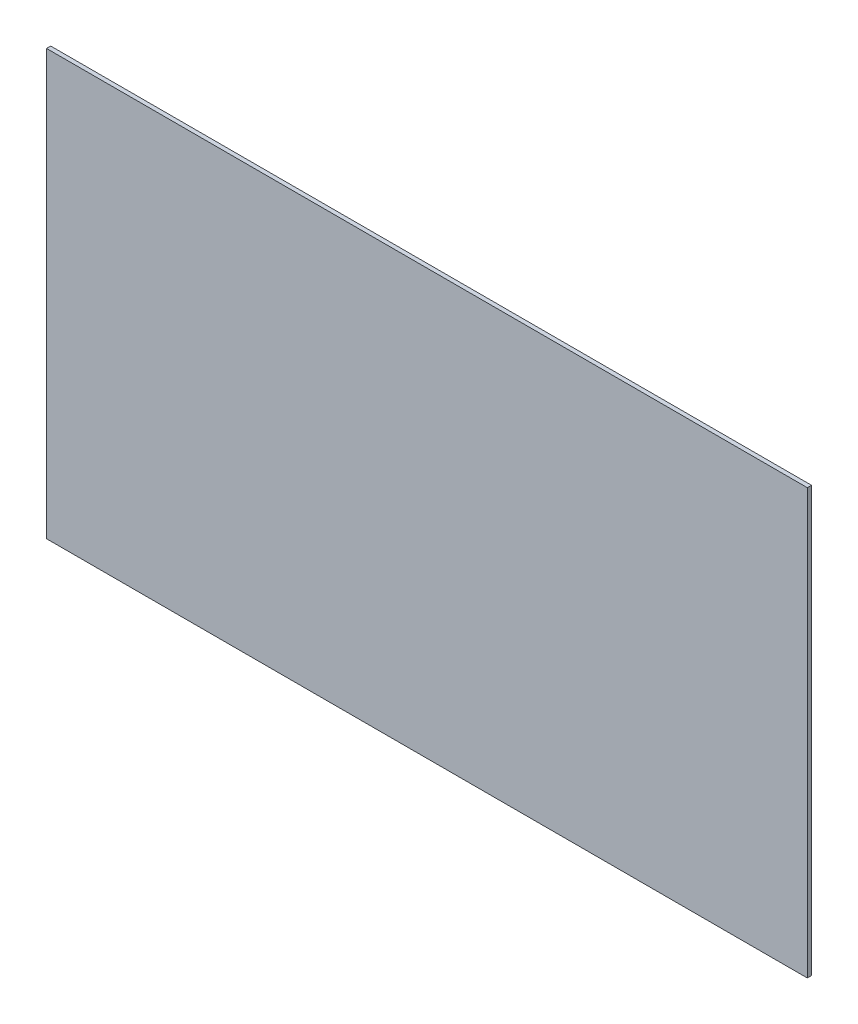
ISO-10303-21;
HEADER;
FILE_DESCRIPTION(('STEP AP214'),'2;1');
FILE_NAME('part.step','',(''),(''),'','','');
FILE_SCHEMA(('AUTOMOTIVE_DESIGN { 1 0 10303 214 1 1 1 1 }'));
ENDSEC;
DATA;
#1=APPLICATION_CONTEXT('core data for automotive mechanical design processes');
#2=APPLICATION_PROTOCOL_DEFINITION('international standard','automotive_design',2000,#1);
#3=PRODUCT_CONTEXT('',#1,'mechanical');
#4=PRODUCT('Part','Part','',(#3));
#5=PRODUCT_RELATED_PRODUCT_CATEGORY('part','',(#4));
#6=PRODUCT_DEFINITION_FORMATION('','',#4);
#7=PRODUCT_DEFINITION_CONTEXT('part definition',#1,'design');
#8=PRODUCT_DEFINITION('design','',#6,#7);
#9=PRODUCT_DEFINITION_SHAPE('','',#8);
#10=(LENGTH_UNIT() NAMED_UNIT(*) SI_UNIT(.MILLI.,.METRE.));
#11=(NAMED_UNIT(*) PLANE_ANGLE_UNIT() SI_UNIT($,.RADIAN.));
#12=(NAMED_UNIT(*) SI_UNIT($,.STERADIAN.) SOLID_ANGLE_UNIT());
#13=UNCERTAINTY_MEASURE_WITH_UNIT(LENGTH_MEASURE(1.E-05),#10,'distance_accuracy_value','');
#14=(GEOMETRIC_REPRESENTATION_CONTEXT(3) GLOBAL_UNCERTAINTY_ASSIGNED_CONTEXT((#13)) GLOBAL_UNIT_ASSIGNED_CONTEXT((#10,
#11,#12)) REPRESENTATION_CONTEXT('',''));
#15=CARTESIAN_POINT('',(0.,0.,0.));
#16=DIRECTION('',(0.,0.,1.));
#17=DIRECTION('',(1.,0.,0.));
#18=AXIS2_PLACEMENT_3D('',#15,#16,#17);
#19=CARTESIAN_POINT('',(273.05,152.4,-3.));
#20=DIRECTION('',(1.,0.,0.));
#21=DIRECTION('',(0.,0.,-1.));
#22=AXIS2_PLACEMENT_3D('',#19,#20,#21);
#23=PLANE('',#22);
#24=DIRECTION('',(0.,1.,0.));
#25=VECTOR('',#24,1.);
#26=CARTESIAN_POINT('',(273.05,152.4,0.));
#27=LINE('',#26,#25);
#28=CARTESIAN_POINT('',(273.05,-152.4,0.));
#29=VERTEX_POINT('',#28);
#30=CARTESIAN_POINT('',(273.05,152.4,0.));
#31=VERTEX_POINT('',#30);
#32=EDGE_CURVE('E115',#29,#31,#27,.T.);
#33=ORIENTED_EDGE('',*,*,#32,.F.);
#34=DIRECTION('',(0.,0.,1.));
#35=VECTOR('',#34,1.);
#36=CARTESIAN_POINT('',(273.05,-152.4,-3.));
#37=LINE('',#36,#35);
#38=CARTESIAN_POINT('',(273.05,-152.4,-3.));
#39=VERTEX_POINT('',#38);
#40=EDGE_CURVE('E11',#39,#29,#37,.T.);
#41=ORIENTED_EDGE('',*,*,#40,.F.);
#42=DIRECTION('',(0.,1.,0.));
#43=VECTOR('',#42,1.);
#44=CARTESIAN_POINT('',(273.05,152.4,-3.));
#45=LINE('',#44,#43);
#46=CARTESIAN_POINT('',(273.05,152.4,-3.));
#47=VERTEX_POINT('',#46);
#48=EDGE_CURVE('E107',#39,#47,#45,.T.);
#49=ORIENTED_EDGE('',*,*,#48,.T.);
#50=DIRECTION('',(0.,0.,1.));
#51=VECTOR('',#50,1.);
#52=CARTESIAN_POINT('',(273.05,152.4,-3.));
#53=LINE('',#52,#51);
#54=EDGE_CURVE('E48',#47,#31,#53,.T.);
#55=ORIENTED_EDGE('',*,*,#54,.T.);
#56=EDGE_LOOP('',(#33,#41,#49,#55));
#57=FACE_BOUND('',#56,.T.);
#58=ADVANCED_FACE('F45',(#57),#23,.T.);
#59=CARTESIAN_POINT('',(-273.05,-152.4,-3.));
#60=DIRECTION('',(0.,-1.,0.));
#61=DIRECTION('',(0.,0.,-1.));
#62=AXIS2_PLACEMENT_3D('',#59,#60,#61);
#63=PLANE('',#62);
#64=DIRECTION('',(1.,0.,0.));
#65=VECTOR('',#64,1.);
#66=CARTESIAN_POINT('',(-273.05,-152.4,0.));
#67=LINE('',#66,#65);
#68=CARTESIAN_POINT('',(-273.05,-152.4,0.));
#69=VERTEX_POINT('',#68);
#70=EDGE_CURVE('E110',#69,#29,#67,.T.);
#71=ORIENTED_EDGE('',*,*,#70,.F.);
#72=DIRECTION('',(0.,0.,1.));
#73=VECTOR('',#72,1.);
#74=CARTESIAN_POINT('',(-273.05,-152.4,-3.));
#75=LINE('',#74,#73);
#76=CARTESIAN_POINT('',(-273.05,-152.4,-3.));
#77=VERTEX_POINT('',#76);
#78=EDGE_CURVE('E55',#77,#69,#75,.T.);
#79=ORIENTED_EDGE('',*,*,#78,.F.);
#80=DIRECTION('',(1.,0.,0.));
#81=VECTOR('',#80,1.);
#82=CARTESIAN_POINT('',(-273.05,-152.4,-3.));
#83=LINE('',#82,#81);
#84=EDGE_CURVE('E102',#77,#39,#83,.T.);
#85=ORIENTED_EDGE('',*,*,#84,.T.);
#86=ORIENTED_EDGE('',*,*,#40,.T.);
#87=EDGE_LOOP('',(#71,#79,#85,#86));
#88=FACE_BOUND('',#87,.T.);
#89=ADVANCED_FACE('F131',(#88),#63,.T.);
#90=CARTESIAN_POINT('',(-273.05,152.4,-3.));
#91=DIRECTION('',(-1.,0.,0.));
#92=DIRECTION('',(0.,0.,1.));
#93=AXIS2_PLACEMENT_3D('',#90,#91,#92);
#94=PLANE('',#93);
#95=DIRECTION('',(0.,-1.,0.));
#96=VECTOR('',#95,1.);
#97=CARTESIAN_POINT('',(-273.05,152.4,0.));
#98=LINE('',#97,#96);
#99=CARTESIAN_POINT('',(-273.05,152.4,0.));
#100=VERTEX_POINT('',#99);
#101=EDGE_CURVE('E96',#100,#69,#98,.T.);
#102=ORIENTED_EDGE('',*,*,#101,.F.);
#103=DIRECTION('',(0.,0.,1.));
#104=VECTOR('',#103,1.);
#105=CARTESIAN_POINT('',(-273.05,152.4,-3.));
#106=LINE('',#105,#104);
#107=CARTESIAN_POINT('',(-273.05,152.4,-3.));
#108=VERTEX_POINT('',#107);
#109=EDGE_CURVE('E91',#108,#100,#106,.T.);
#110=ORIENTED_EDGE('',*,*,#109,.F.);
#111=DIRECTION('',(0.,-1.,0.));
#112=VECTOR('',#111,1.);
#113=CARTESIAN_POINT('',(-273.05,152.4,-3.));
#114=LINE('',#113,#112);
#115=EDGE_CURVE('E94',#108,#77,#114,.T.);
#116=ORIENTED_EDGE('',*,*,#115,.T.);
#117=ORIENTED_EDGE('',*,*,#78,.T.);
#118=EDGE_LOOP('',(#102,#110,#116,#117));
#119=FACE_BOUND('',#118,.T.);
#120=ADVANCED_FACE('F93',(#119),#94,.T.);
#121=CARTESIAN_POINT('',(-273.05,152.4,-3.));
#122=DIRECTION('',(0.,1.,0.));
#123=DIRECTION('',(0.,0.,1.));
#124=AXIS2_PLACEMENT_3D('',#121,#122,#123);
#125=PLANE('',#124);
#126=DIRECTION('',(-1.,0.,0.));
#127=VECTOR('',#126,1.);
#128=CARTESIAN_POINT('',(-273.05,152.4,0.));
#129=LINE('',#128,#127);
#130=EDGE_CURVE('E119',#31,#100,#129,.T.);
#131=ORIENTED_EDGE('',*,*,#130,.F.);
#132=ORIENTED_EDGE('',*,*,#54,.F.);
#133=DIRECTION('',(-1.,0.,0.));
#134=VECTOR('',#133,1.);
#135=CARTESIAN_POINT('',(-273.05,152.4,-3.));
#136=LINE('',#135,#134);
#137=EDGE_CURVE('E101',#47,#108,#136,.T.);
#138=ORIENTED_EDGE('',*,*,#137,.T.);
#139=ORIENTED_EDGE('',*,*,#109,.T.);
#140=EDGE_LOOP('',(#131,#132,#138,#139));
#141=FACE_BOUND('',#140,.T.);
#142=ADVANCED_FACE('F105',(#141),#125,.T.);
#143=CARTESIAN_POINT('',(0.,0.,-3.));
#144=DIRECTION('',(0.,0.,1.));
#145=DIRECTION('',(1.,0.,0.));
#146=AXIS2_PLACEMENT_3D('',#143,#144,#145);
#147=PLANE('',#146);
#148=ORIENTED_EDGE('',*,*,#48,.F.);
#149=ORIENTED_EDGE('',*,*,#84,.F.);
#150=ORIENTED_EDGE('',*,*,#115,.F.);
#151=ORIENTED_EDGE('',*,*,#137,.F.);
#152=EDGE_LOOP('',(#148,#149,#150,#151));
#153=FACE_BOUND('',#152,.T.);
#154=ADVANCED_FACE('F100',(#153),#147,.F.);
#155=CARTESIAN_POINT('',(0.,0.,0.));
#156=DIRECTION('',(0.,0.,1.));
#157=DIRECTION('',(1.,0.,0.));
#158=AXIS2_PLACEMENT_3D('',#155,#156,#157);
#159=PLANE('',#158);
#160=ORIENTED_EDGE('',*,*,#32,.T.);
#161=ORIENTED_EDGE('',*,*,#130,.T.);
#162=ORIENTED_EDGE('',*,*,#101,.T.);
#163=ORIENTED_EDGE('',*,*,#70,.T.);
#164=EDGE_LOOP('',(#160,#161,#162,#163));
#165=FACE_BOUND('',#164,.T.);
#166=ADVANCED_FACE('F130',(#165),#159,.T.);
#167=CLOSED_SHELL('',(#58,#89,#120,#142,#154,#166));
#168=MANIFOLD_SOLID_BREP('B2',#167);
#169=ADVANCED_BREP_SHAPE_REPRESENTATION('',(#18,#168),#14);
#170=SHAPE_DEFINITION_REPRESENTATION(#9,#169);
ENDSEC;
END-ISO-10303-21;
